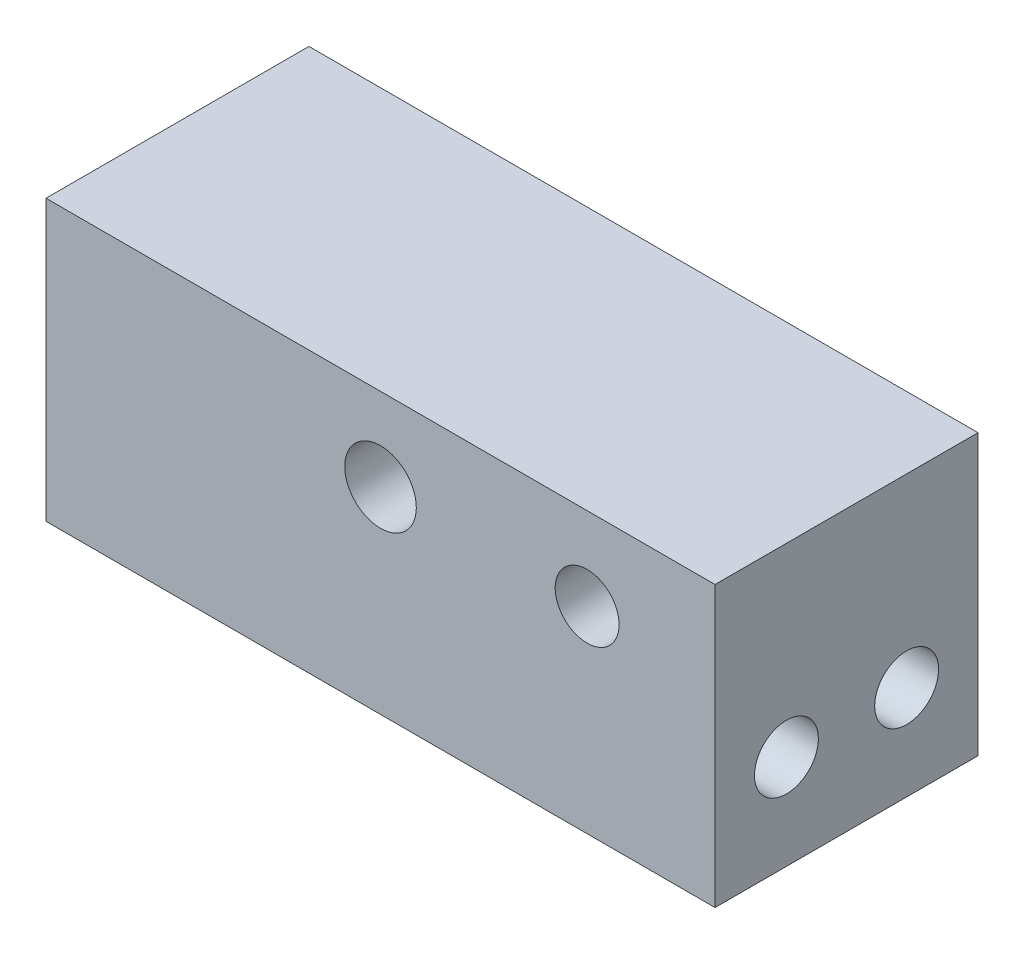
ISO-10303-21;
HEADER;
FILE_DESCRIPTION(('STEP AP214'),'2;1');
FILE_NAME('part.step','',(''),(''),'','','');
FILE_SCHEMA(('AUTOMOTIVE_DESIGN { 1 0 10303 214 1 1 1 1 }'));
ENDSEC;
DATA;
#1=APPLICATION_CONTEXT('core data for automotive mechanical design processes');
#2=APPLICATION_PROTOCOL_DEFINITION('international standard','automotive_design',2000,#1);
#3=PRODUCT_CONTEXT('',#1,'mechanical');
#4=PRODUCT('Part','Part','',(#3));
#5=PRODUCT_RELATED_PRODUCT_CATEGORY('part','',(#4));
#6=PRODUCT_DEFINITION_FORMATION('','',#4);
#7=PRODUCT_DEFINITION_CONTEXT('part definition',#1,'design');
#8=PRODUCT_DEFINITION('design','',#6,#7);
#9=PRODUCT_DEFINITION_SHAPE('','',#8);
#10=(LENGTH_UNIT() NAMED_UNIT(*) SI_UNIT(.MILLI.,.METRE.));
#11=(NAMED_UNIT(*) PLANE_ANGLE_UNIT() SI_UNIT($,.RADIAN.));
#12=(NAMED_UNIT(*) SI_UNIT($,.STERADIAN.) SOLID_ANGLE_UNIT());
#13=UNCERTAINTY_MEASURE_WITH_UNIT(LENGTH_MEASURE(1.E-05),#10,'distance_accuracy_value','');
#14=(GEOMETRIC_REPRESENTATION_CONTEXT(3) GLOBAL_UNCERTAINTY_ASSIGNED_CONTEXT((#13)) GLOBAL_UNIT_ASSIGNED_CONTEXT((#10,
#11,#12)) REPRESENTATION_CONTEXT('',''));
#15=CARTESIAN_POINT('',(0.,0.,0.));
#16=DIRECTION('',(0.,0.,1.));
#17=DIRECTION('',(1.,0.,0.));
#18=AXIS2_PLACEMENT_3D('',#15,#16,#17);
#19=CARTESIAN_POINT('',(-28.275,11.1125,22.225));
#20=DIRECTION('',(0.,1.,0.));
#21=DIRECTION('',(0.,0.,1.));
#22=AXIS2_PLACEMENT_3D('',#19,#20,#21);
#23=PLANE('',#22);
#24=DIRECTION('',(1.,0.,0.));
#25=VECTOR('',#24,1.);
#26=CARTESIAN_POINT('',(-28.275,11.1125,0.));
#27=LINE('',#26,#25);
#28=CARTESIAN_POINT('',(-28.275,11.1125,0.));
#29=VERTEX_POINT('',#28);
#30=CARTESIAN_POINT('',(28.275,11.1125,0.));
#31=VERTEX_POINT('',#30);
#32=EDGE_CURVE('E146',#29,#31,#27,.T.);
#33=ORIENTED_EDGE('',*,*,#32,.F.);
#34=DIRECTION('',(0.,0.,-1.));
#35=VECTOR('',#34,1.);
#36=CARTESIAN_POINT('',(-28.275,11.1125,22.225));
#37=LINE('',#36,#35);
#38=CARTESIAN_POINT('',(-28.275,11.1125,22.225));
#39=VERTEX_POINT('',#38);
#40=EDGE_CURVE('E11',#39,#29,#37,.T.);
#41=ORIENTED_EDGE('',*,*,#40,.F.);
#42=DIRECTION('',(1.,0.,0.));
#43=VECTOR('',#42,1.);
#44=CARTESIAN_POINT('',(-28.275,11.1125,22.225));
#45=LINE('',#44,#43);
#46=CARTESIAN_POINT('',(28.275,11.1125,22.225));
#47=VERTEX_POINT('',#46);
#48=EDGE_CURVE('E95',#39,#47,#45,.T.);
#49=ORIENTED_EDGE('',*,*,#48,.T.);
#50=DIRECTION('',(0.,0.,-1.));
#51=VECTOR('',#50,1.);
#52=CARTESIAN_POINT('',(28.275,11.1125,22.225));
#53=LINE('',#52,#51);
#54=EDGE_CURVE('E48',#47,#31,#53,.T.);
#55=ORIENTED_EDGE('',*,*,#54,.T.);
#56=EDGE_LOOP('',(#33,#41,#49,#55));
#57=FACE_BOUND('',#56,.T.);
#58=ADVANCED_FACE('F45',(#57),#23,.T.);
#59=CARTESIAN_POINT('',(-28.275,11.1125,22.225));
#60=DIRECTION('',(1.,0.,0.));
#61=DIRECTION('',(0.,1.,0.));
#62=AXIS2_PLACEMENT_3D('',#59,#60,#61);
#63=PLANE('',#62);
#64=CARTESIAN_POINT('',(-28.275,-4.53750010000002,16.1925));
#65=DIRECTION('',(-1.,0.,0.));
#66=DIRECTION('',(0.,-1.,0.));
#67=AXIS2_PLACEMENT_3D('',#64,#65,#66);
#68=CIRCLE('',#67,2.7);
#69=CARTESIAN_POINT('',(-28.275,-7.23750010000002,16.1925));
#70=VERTEX_POINT('',#69);
#71=EDGE_CURVE('E131',#70,#70,#68,.T.);
#72=ORIENTED_EDGE('',*,*,#71,.F.);
#73=EDGE_LOOP('',(#72));
#74=FACE_BOUND('',#73,.T.);
#75=CARTESIAN_POINT('',(-28.275,-4.53750010000002,6.0325));
#76=DIRECTION('',(-1.,0.,0.));
#77=DIRECTION('',(0.,-1.,0.));
#78=AXIS2_PLACEMENT_3D('',#75,#76,#77);
#79=CIRCLE('',#78,2.7);
#80=CARTESIAN_POINT('',(-28.275,-7.23750010000002,6.0325));
#81=VERTEX_POINT('',#80);
#82=EDGE_CURVE('E135',#81,#81,#79,.T.);
#83=ORIENTED_EDGE('',*,*,#82,.F.);
#84=EDGE_LOOP('',(#83));
#85=FACE_BOUND('',#84,.T.);
#86=DIRECTION('',(0.,-1.,0.));
#87=VECTOR('',#86,1.);
#88=CARTESIAN_POINT('',(-28.275,11.1125,0.));
#89=LINE('',#88,#87);
#90=CARTESIAN_POINT('',(-28.275,-12.53744,0.));
#91=VERTEX_POINT('',#90);
#92=EDGE_CURVE('E87',#29,#91,#89,.T.);
#93=ORIENTED_EDGE('',*,*,#92,.T.);
#94=DIRECTION('',(0.,0.,-1.));
#95=VECTOR('',#94,1.);
#96=CARTESIAN_POINT('',(-28.275,-12.53744,22.225));
#97=LINE('',#96,#95);
#98=CARTESIAN_POINT('',(-28.275,-12.53744,22.225));
#99=VERTEX_POINT('',#98);
#100=EDGE_CURVE('E91',#99,#91,#97,.T.);
#101=ORIENTED_EDGE('',*,*,#100,.F.);
#102=DIRECTION('',(0.,-1.,0.));
#103=VECTOR('',#102,1.);
#104=CARTESIAN_POINT('',(-28.275,11.1125,22.225));
#105=LINE('',#104,#103);
#106=EDGE_CURVE('E74',#39,#99,#105,.T.);
#107=ORIENTED_EDGE('',*,*,#106,.F.);
#108=ORIENTED_EDGE('',*,*,#40,.T.);
#109=EDGE_LOOP('',(#93,#101,#107,#108));
#110=FACE_BOUND('',#109,.T.);
#111=ADVANCED_FACE('F89',(#74,#85,#110),#63,.F.);
#112=CARTESIAN_POINT('',(28.275,11.1125,22.225));
#113=DIRECTION('',(1.,0.,0.));
#114=DIRECTION('',(0.,1.,0.));
#115=AXIS2_PLACEMENT_3D('',#112,#113,#114);
#116=PLANE('',#115);
#117=CARTESIAN_POINT('',(28.275,-4.53750010000002,16.1925));
#118=DIRECTION('',(-1.,0.,0.));
#119=DIRECTION('',(0.,-1.,0.));
#120=AXIS2_PLACEMENT_3D('',#117,#118,#119);
#121=CIRCLE('',#120,2.7);
#122=CARTESIAN_POINT('',(28.275,-7.23750010000002,16.1925));
#123=VERTEX_POINT('',#122);
#124=EDGE_CURVE('E115',#123,#123,#121,.T.);
#125=ORIENTED_EDGE('',*,*,#124,.T.);
#126=EDGE_LOOP('',(#125));
#127=FACE_BOUND('',#126,.T.);
#128=CARTESIAN_POINT('',(28.275,-4.53750010000002,6.0325));
#129=DIRECTION('',(-1.,0.,0.));
#130=DIRECTION('',(0.,-1.,0.));
#131=AXIS2_PLACEMENT_3D('',#128,#129,#130);
#132=CIRCLE('',#131,2.7);
#133=CARTESIAN_POINT('',(28.275,-7.23750010000002,6.0325));
#134=VERTEX_POINT('',#133);
#135=EDGE_CURVE('E118',#134,#134,#132,.T.);
#136=ORIENTED_EDGE('',*,*,#135,.T.);
#137=EDGE_LOOP('',(#136));
#138=FACE_BOUND('',#137,.T.);
#139=DIRECTION('',(0.,-1.,0.));
#140=VECTOR('',#139,1.);
#141=CARTESIAN_POINT('',(28.275,11.1125,0.));
#142=LINE('',#141,#140);
#143=CARTESIAN_POINT('',(28.275,-12.53744,0.));
#144=VERTEX_POINT('',#143);
#145=EDGE_CURVE('E96',#31,#144,#142,.T.);
#146=ORIENTED_EDGE('',*,*,#145,.F.);
#147=ORIENTED_EDGE('',*,*,#54,.F.);
#148=DIRECTION('',(0.,-1.,0.));
#149=VECTOR('',#148,1.);
#150=CARTESIAN_POINT('',(28.275,11.1125,22.225));
#151=LINE('',#150,#149);
#152=CARTESIAN_POINT('',(28.275,-12.53744,22.225));
#153=VERTEX_POINT('',#152);
#154=EDGE_CURVE('E160',#47,#153,#151,.T.);
#155=ORIENTED_EDGE('',*,*,#154,.T.);
#156=DIRECTION('',(0.,0.,1.));
#157=VECTOR('',#156,1.);
#158=CARTESIAN_POINT('',(28.275,-12.53744,0.));
#159=LINE('',#158,#157);
#160=EDGE_CURVE('E105',#144,#153,#159,.T.);
#161=ORIENTED_EDGE('',*,*,#160,.F.);
#162=EDGE_LOOP('',(#146,#147,#155,#161));
#163=FACE_BOUND('',#162,.T.);
#164=ADVANCED_FACE('F193',(#127,#138,#163),#116,.T.);
#165=CARTESIAN_POINT('',(0.,0.,22.225));
#166=DIRECTION('',(0.,0.,-1.));
#167=DIRECTION('',(-1.,0.,0.));
#168=AXIS2_PLACEMENT_3D('',#165,#166,#167);
#169=PLANE('',#168);
#170=CARTESIAN_POINT('',(17.4625,4.1125,22.225));
#171=DIRECTION('',(0.,0.,1.));
#172=DIRECTION('',(1.,0.,0.));
#173=AXIS2_PLACEMENT_3D('',#170,#171,#172);
#174=CIRCLE('',#173,2.7);
#175=CARTESIAN_POINT('',(20.1625,4.1125,22.225));
#176=VERTEX_POINT('',#175);
#177=EDGE_CURVE('E147',#176,#176,#174,.T.);
#178=ORIENTED_EDGE('',*,*,#177,.F.);
#179=EDGE_LOOP('',(#178));
#180=FACE_BOUND('',#179,.T.);
#181=CARTESIAN_POINT('',(0.,4.1125,22.225));
#182=DIRECTION('',(0.,0.,1.));
#183=DIRECTION('',(1.,0.,0.));
#184=AXIS2_PLACEMENT_3D('',#181,#182,#183);
#185=CIRCLE('',#184,3.025);
#186=CARTESIAN_POINT('',(3.025,4.1125,22.225));
#187=VERTEX_POINT('',#186);
#188=EDGE_CURVE('E130',#187,#187,#185,.T.);
#189=ORIENTED_EDGE('',*,*,#188,.F.);
#190=EDGE_LOOP('',(#189));
#191=FACE_BOUND('',#190,.T.);
#192=ORIENTED_EDGE('',*,*,#48,.F.);
#193=ORIENTED_EDGE('',*,*,#106,.T.);
#194=DIRECTION('',(-1.,0.,0.));
#195=VECTOR('',#194,1.);
#196=CARTESIAN_POINT('',(28.275,-12.53744,22.225));
#197=LINE('',#196,#195);
#198=EDGE_CURVE('E108',#153,#99,#197,.T.);
#199=ORIENTED_EDGE('',*,*,#198,.F.);
#200=ORIENTED_EDGE('',*,*,#154,.F.);
#201=EDGE_LOOP('',(#192,#193,#199,#200));
#202=FACE_BOUND('',#201,.T.);
#203=ADVANCED_FACE('F201',(#180,#191,#202),#169,.F.);
#204=CARTESIAN_POINT('',(0.,0.,0.));
#205=DIRECTION('',(0.,0.,-1.));
#206=DIRECTION('',(-1.,0.,0.));
#207=AXIS2_PLACEMENT_3D('',#204,#205,#206);
#208=PLANE('',#207);
#209=CARTESIAN_POINT('',(10.,1.1125,0.));
#210=DIRECTION('',(0.,0.,-1.));
#211=DIRECTION('',(-1.,0.,0.));
#212=AXIS2_PLACEMENT_3D('',#209,#210,#211);
#213=CIRCLE('',#212,3.025);
#214=CARTESIAN_POINT('',(6.975,1.1125,0.));
#215=VERTEX_POINT('',#214);
#216=EDGE_CURVE('E280',#215,#215,#213,.T.);
#217=ORIENTED_EDGE('',*,*,#216,.F.);
#218=EDGE_LOOP('',(#217));
#219=FACE_BOUND('',#218,.T.);
#220=CARTESIAN_POINT('',(-10.,1.1125,0.));
#221=DIRECTION('',(0.,0.,-1.));
#222=DIRECTION('',(-1.,0.,0.));
#223=AXIS2_PLACEMENT_3D('',#220,#221,#222);
#224=CIRCLE('',#223,3.025);
#225=CARTESIAN_POINT('',(-13.025,1.1125,0.));
#226=VERTEX_POINT('',#225);
#227=EDGE_CURVE('E288',#226,#226,#224,.T.);
#228=ORIENTED_EDGE('',*,*,#227,.F.);
#229=EDGE_LOOP('',(#228));
#230=FACE_BOUND('',#229,.T.);
#231=ORIENTED_EDGE('',*,*,#32,.T.);
#232=ORIENTED_EDGE('',*,*,#145,.T.);
#233=DIRECTION('',(1.,0.,0.));
#234=VECTOR('',#233,1.);
#235=CARTESIAN_POINT('',(-28.275,-12.53744,0.));
#236=LINE('',#235,#234);
#237=EDGE_CURVE('E99',#91,#144,#236,.T.);
#238=ORIENTED_EDGE('',*,*,#237,.F.);
#239=ORIENTED_EDGE('',*,*,#92,.F.);
#240=EDGE_LOOP('',(#231,#232,#238,#239));
#241=FACE_BOUND('',#240,.T.);
#242=ADVANCED_FACE('F100',(#219,#230,#241),#208,.T.);
#243=CARTESIAN_POINT('',(0.,4.1125,12.225));
#244=DIRECTION('',(0.,0.,1.));
#245=DIRECTION('',(1.,0.,0.));
#246=AXIS2_PLACEMENT_3D('',#243,#244,#245);
#247=CYLINDRICAL_SURFACE('',#246,3.025);
#248=CARTESIAN_POINT('',(0.,4.1125,12.225));
#249=DIRECTION('',(0.,0.,1.));
#250=DIRECTION('',(1.,0.,0.));
#251=AXIS2_PLACEMENT_3D('',#248,#249,#250);
#252=CIRCLE('',#251,3.025);
#253=CARTESIAN_POINT('',(3.025,4.1125,12.225));
#254=VERTEX_POINT('',#253);
#255=EDGE_CURVE('E151',#254,#254,#252,.T.);
#256=ORIENTED_EDGE('',*,*,#255,.F.);
#257=EDGE_LOOP('',(#256));
#258=FACE_BOUND('',#257,.T.);
#259=ORIENTED_EDGE('',*,*,#188,.T.);
#260=EDGE_LOOP('',(#259));
#261=FACE_BOUND('',#260,.T.);
#262=ADVANCED_FACE('F208',(#258,#261),#247,.F.);
#263=CARTESIAN_POINT('',(0.,0.,12.225));
#264=DIRECTION('',(0.,0.,1.));
#265=DIRECTION('',(1.,0.,0.));
#266=AXIS2_PLACEMENT_3D('',#263,#264,#265);
#267=PLANE('',#266);
#268=ORIENTED_EDGE('',*,*,#255,.T.);
#269=EDGE_LOOP('',(#268));
#270=FACE_BOUND('',#269,.T.);
#271=ADVANCED_FACE('F213',(#270),#267,.T.);
#272=CARTESIAN_POINT('',(17.4625,4.1125,12.225));
#273=DIRECTION('',(0.,0.,1.));
#274=DIRECTION('',(1.,0.,0.));
#275=AXIS2_PLACEMENT_3D('',#272,#273,#274);
#276=CYLINDRICAL_SURFACE('',#275,2.7);
#277=CARTESIAN_POINT('',(17.4625,4.1125,12.225));
#278=DIRECTION('',(0.,0.,1.));
#279=DIRECTION('',(1.,0.,0.));
#280=AXIS2_PLACEMENT_3D('',#277,#278,#279);
#281=CIRCLE('',#280,2.7);
#282=CARTESIAN_POINT('',(20.1625,4.1125,12.225));
#283=VERTEX_POINT('',#282);
#284=EDGE_CURVE('E142',#283,#283,#281,.T.);
#285=ORIENTED_EDGE('',*,*,#284,.F.);
#286=EDGE_LOOP('',(#285));
#287=FACE_BOUND('',#286,.T.);
#288=ORIENTED_EDGE('',*,*,#177,.T.);
#289=EDGE_LOOP('',(#288));
#290=FACE_BOUND('',#289,.T.);
#291=ADVANCED_FACE('F217',(#287,#290),#276,.F.);
#292=CARTESIAN_POINT('',(0.,0.,12.225));
#293=DIRECTION('',(0.,0.,1.));
#294=DIRECTION('',(1.,0.,0.));
#295=AXIS2_PLACEMENT_3D('',#292,#293,#294);
#296=PLANE('',#295);
#297=ORIENTED_EDGE('',*,*,#284,.T.);
#298=EDGE_LOOP('',(#297));
#299=FACE_BOUND('',#298,.T.);
#300=ADVANCED_FACE('F221',(#299),#296,.T.);
#301=CARTESIAN_POINT('',(-20.275,-4.53750010000002,6.0325));
#302=DIRECTION('',(-1.,0.,0.));
#303=DIRECTION('',(0.,-1.,0.));
#304=AXIS2_PLACEMENT_3D('',#301,#302,#303);
#305=CYLINDRICAL_SURFACE('',#304,2.7);
#306=CARTESIAN_POINT('',(-20.275,-4.53750010000002,6.0325));
#307=DIRECTION('',(-1.,0.,0.));
#308=DIRECTION('',(0.,-1.,0.));
#309=AXIS2_PLACEMENT_3D('',#306,#307,#308);
#310=CIRCLE('',#309,2.7);
#311=CARTESIAN_POINT('',(-20.275,-7.23750010000002,6.0325));
#312=VERTEX_POINT('',#311);
#313=EDGE_CURVE('E125',#312,#312,#310,.T.);
#314=ORIENTED_EDGE('',*,*,#313,.F.);
#315=EDGE_LOOP('',(#314));
#316=FACE_BOUND('',#315,.T.);
#317=ORIENTED_EDGE('',*,*,#82,.T.);
#318=EDGE_LOOP('',(#317));
#319=FACE_BOUND('',#318,.T.);
#320=ADVANCED_FACE('F225',(#316,#319),#305,.F.);
#321=CARTESIAN_POINT('',(-20.275,-4.53750010000002,6.0325));
#322=DIRECTION('',(-1.,0.,0.));
#323=DIRECTION('',(0.,-1.,0.));
#324=AXIS2_PLACEMENT_3D('',#321,#322,#323);
#325=PLANE('',#324);
#326=ORIENTED_EDGE('',*,*,#313,.T.);
#327=EDGE_LOOP('',(#326));
#328=FACE_BOUND('',#327,.T.);
#329=ADVANCED_FACE('F227',(#328),#325,.T.);
#330=CARTESIAN_POINT('',(-20.275,-4.53750010000002,16.1925));
#331=DIRECTION('',(-1.,0.,0.));
#332=DIRECTION('',(0.,-1.,0.));
#333=AXIS2_PLACEMENT_3D('',#330,#331,#332);
#334=CYLINDRICAL_SURFACE('',#333,2.7);
#335=CARTESIAN_POINT('',(-20.275,-4.53750010000002,16.1925));
#336=DIRECTION('',(-1.,0.,0.));
#337=DIRECTION('',(0.,-1.,0.));
#338=AXIS2_PLACEMENT_3D('',#335,#336,#337);
#339=CIRCLE('',#338,2.7);
#340=CARTESIAN_POINT('',(-20.275,-7.23750010000002,16.1925));
#341=VERTEX_POINT('',#340);
#342=EDGE_CURVE('E126',#341,#341,#339,.T.);
#343=ORIENTED_EDGE('',*,*,#342,.F.);
#344=EDGE_LOOP('',(#343));
#345=FACE_BOUND('',#344,.T.);
#346=ORIENTED_EDGE('',*,*,#71,.T.);
#347=EDGE_LOOP('',(#346));
#348=FACE_BOUND('',#347,.T.);
#349=ADVANCED_FACE('F230',(#345,#348),#334,.F.);
#350=CARTESIAN_POINT('',(-20.275,-4.53750010000002,16.1925));
#351=DIRECTION('',(-1.,0.,0.));
#352=DIRECTION('',(0.,-1.,0.));
#353=AXIS2_PLACEMENT_3D('',#350,#351,#352);
#354=PLANE('',#353);
#355=ORIENTED_EDGE('',*,*,#342,.T.);
#356=EDGE_LOOP('',(#355));
#357=FACE_BOUND('',#356,.T.);
#358=ADVANCED_FACE('F237',(#357),#354,.T.);
#359=CARTESIAN_POINT('',(0.,-12.53744,0.));
#360=DIRECTION('',(0.,-1.,0.));
#361=DIRECTION('',(0.,0.,-1.));
#362=AXIS2_PLACEMENT_3D('',#359,#360,#361);
#363=PLANE('',#362);
#364=ORIENTED_EDGE('',*,*,#100,.T.);
#365=ORIENTED_EDGE('',*,*,#237,.T.);
#366=ORIENTED_EDGE('',*,*,#160,.T.);
#367=ORIENTED_EDGE('',*,*,#198,.T.);
#368=EDGE_LOOP('',(#364,#365,#366,#367));
#369=FACE_BOUND('',#368,.T.);
#370=ADVANCED_FACE('F107',(#369),#363,.T.);
#371=CARTESIAN_POINT('',(20.275,-4.53750010000002,6.0325));
#372=DIRECTION('',(1.,0.,0.));
#373=DIRECTION('',(0.,1.,0.));
#374=AXIS2_PLACEMENT_3D('',#371,#372,#373);
#375=CYLINDRICAL_SURFACE('',#374,2.7);
#376=CARTESIAN_POINT('',(20.275,-4.53750010000002,6.0325));
#377=DIRECTION('',(-1.,0.,0.));
#378=DIRECTION('',(0.,-1.,0.));
#379=AXIS2_PLACEMENT_3D('',#376,#377,#378);
#380=CIRCLE('',#379,2.7);
#381=CARTESIAN_POINT('',(20.275,-7.23750010000002,6.0325));
#382=VERTEX_POINT('',#381);
#383=EDGE_CURVE('E286',#382,#382,#380,.T.);
#384=ORIENTED_EDGE('',*,*,#383,.T.);
#385=EDGE_LOOP('',(#384));
#386=FACE_BOUND('',#385,.T.);
#387=ORIENTED_EDGE('',*,*,#135,.F.);
#388=EDGE_LOOP('',(#387));
#389=FACE_BOUND('',#388,.T.);
#390=ADVANCED_FACE('F243',(#386,#389),#375,.F.);
#391=CARTESIAN_POINT('',(20.275,-4.53750010000002,6.0325));
#392=DIRECTION('',(1.,0.,0.));
#393=DIRECTION('',(0.,-1.,0.));
#394=AXIS2_PLACEMENT_3D('',#391,#392,#393);
#395=PLANE('',#394);
#396=ORIENTED_EDGE('',*,*,#383,.F.);
#397=EDGE_LOOP('',(#396));
#398=FACE_BOUND('',#397,.T.);
#399=ADVANCED_FACE('F246',(#398),#395,.T.);
#400=CARTESIAN_POINT('',(20.275,-4.53750010000002,16.1925));
#401=DIRECTION('',(1.,0.,0.));
#402=DIRECTION('',(0.,1.,0.));
#403=AXIS2_PLACEMENT_3D('',#400,#401,#402);
#404=CYLINDRICAL_SURFACE('',#403,2.7);
#405=CARTESIAN_POINT('',(20.275,-4.53750010000002,16.1925));
#406=DIRECTION('',(-1.,0.,0.));
#407=DIRECTION('',(0.,-1.,0.));
#408=AXIS2_PLACEMENT_3D('',#405,#406,#407);
#409=CIRCLE('',#408,2.7);
#410=CARTESIAN_POINT('',(20.275,-7.23750010000002,16.1925));
#411=VERTEX_POINT('',#410);
#412=EDGE_CURVE('E110',#411,#411,#409,.T.);
#413=ORIENTED_EDGE('',*,*,#412,.T.);
#414=EDGE_LOOP('',(#413));
#415=FACE_BOUND('',#414,.T.);
#416=ORIENTED_EDGE('',*,*,#124,.F.);
#417=EDGE_LOOP('',(#416));
#418=FACE_BOUND('',#417,.T.);
#419=ADVANCED_FACE('F250',(#415,#418),#404,.F.);
#420=CARTESIAN_POINT('',(20.275,-4.53750010000002,16.1925));
#421=DIRECTION('',(1.,0.,0.));
#422=DIRECTION('',(0.,-1.,0.));
#423=AXIS2_PLACEMENT_3D('',#420,#421,#422);
#424=PLANE('',#423);
#425=ORIENTED_EDGE('',*,*,#412,.F.);
#426=EDGE_LOOP('',(#425));
#427=FACE_BOUND('',#426,.T.);
#428=ADVANCED_FACE('F254',(#427),#424,.T.);
#429=CARTESIAN_POINT('',(-10.,1.1125,10.));
#430=DIRECTION('',(0.,0.,-1.));
#431=DIRECTION('',(-1.,0.,0.));
#432=AXIS2_PLACEMENT_3D('',#429,#430,#431);
#433=CYLINDRICAL_SURFACE('',#432,3.025);
#434=CARTESIAN_POINT('',(-10.,1.1125,10.));
#435=DIRECTION('',(0.,0.,-1.));
#436=DIRECTION('',(-1.,0.,0.));
#437=AXIS2_PLACEMENT_3D('',#434,#435,#436);
#438=CIRCLE('',#437,3.025);
#439=CARTESIAN_POINT('',(-13.025,1.1125,10.));
#440=VERTEX_POINT('',#439);
#441=EDGE_CURVE('E294',#440,#440,#438,.T.);
#442=ORIENTED_EDGE('',*,*,#441,.F.);
#443=EDGE_LOOP('',(#442));
#444=FACE_BOUND('',#443,.T.);
#445=ORIENTED_EDGE('',*,*,#227,.T.);
#446=EDGE_LOOP('',(#445));
#447=FACE_BOUND('',#446,.T.);
#448=ADVANCED_FACE('F258',(#444,#447),#433,.F.);
#449=CARTESIAN_POINT('',(-10.,1.1125,10.));
#450=DIRECTION('',(0.,0.,-1.));
#451=DIRECTION('',(-1.,0.,0.));
#452=AXIS2_PLACEMENT_3D('',#449,#450,#451);
#453=PLANE('',#452);
#454=ORIENTED_EDGE('',*,*,#441,.T.);
#455=EDGE_LOOP('',(#454));
#456=FACE_BOUND('',#455,.T.);
#457=ADVANCED_FACE('F260',(#456),#453,.T.);
#458=CARTESIAN_POINT('',(10.,1.1125,10.));
#459=DIRECTION('',(0.,0.,-1.));
#460=DIRECTION('',(-1.,0.,0.));
#461=AXIS2_PLACEMENT_3D('',#458,#459,#460);
#462=CYLINDRICAL_SURFACE('',#461,3.025);
#463=CARTESIAN_POINT('',(10.,1.1125,10.));
#464=DIRECTION('',(0.,0.,-1.));
#465=DIRECTION('',(-1.,0.,0.));
#466=AXIS2_PLACEMENT_3D('',#463,#464,#465);
#467=CIRCLE('',#466,3.025);
#468=CARTESIAN_POINT('',(6.975,1.1125,10.));
#469=VERTEX_POINT('',#468);
#470=EDGE_CURVE('E278',#469,#469,#467,.T.);
#471=ORIENTED_EDGE('',*,*,#470,.F.);
#472=EDGE_LOOP('',(#471));
#473=FACE_BOUND('',#472,.T.);
#474=ORIENTED_EDGE('',*,*,#216,.T.);
#475=EDGE_LOOP('',(#474));
#476=FACE_BOUND('',#475,.T.);
#477=ADVANCED_FACE('F263',(#473,#476),#462,.F.);
#478=CARTESIAN_POINT('',(10.,1.1125,10.));
#479=DIRECTION('',(0.,0.,-1.));
#480=DIRECTION('',(-1.,0.,0.));
#481=AXIS2_PLACEMENT_3D('',#478,#479,#480);
#482=PLANE('',#481);
#483=ORIENTED_EDGE('',*,*,#470,.T.);
#484=EDGE_LOOP('',(#483));
#485=FACE_BOUND('',#484,.T.);
#486=ADVANCED_FACE('F270',(#485),#482,.T.);
#487=CLOSED_SHELL('',(#58,#111,#164,#203,#242,#262,#271,#291,#300,#320,#329,#349,#358,#370,#390,
#399,#419,#428,#448,#457,#477,#486));
#488=MANIFOLD_SOLID_BREP('B2',#487);
#489=ADVANCED_BREP_SHAPE_REPRESENTATION('',(#18,#488),#14);
#490=SHAPE_DEFINITION_REPRESENTATION(#9,#489);
ENDSEC;
END-ISO-10303-21;
